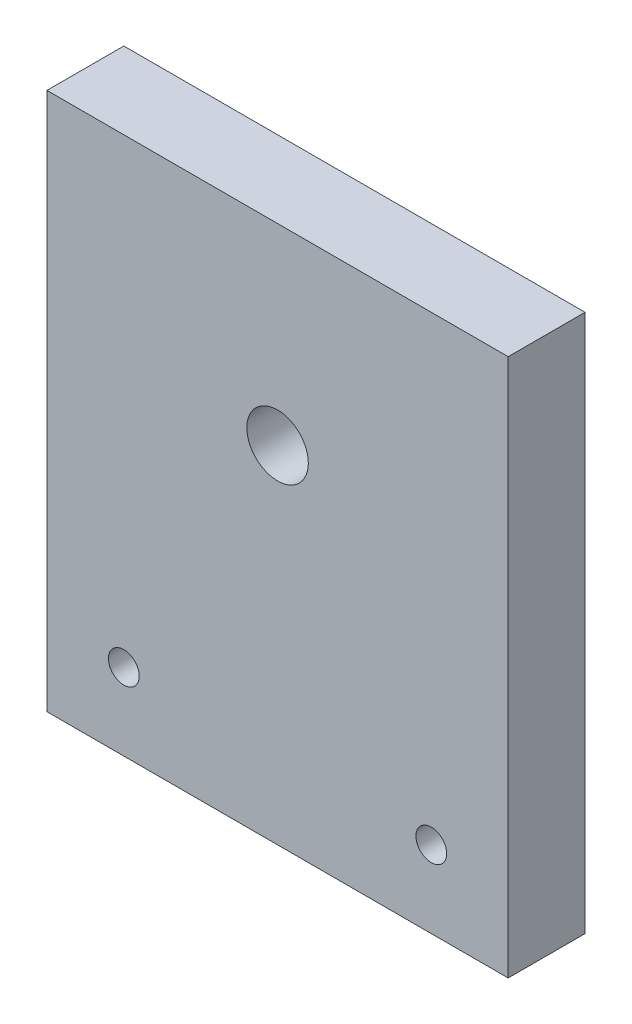
ISO-10303-21;
HEADER;
FILE_DESCRIPTION(('STEP AP214'),'2;1');
FILE_NAME('part.step','',(''),(''),'','','');
FILE_SCHEMA(('AUTOMOTIVE_DESIGN { 1 0 10303 214 1 1 1 1 }'));
ENDSEC;
DATA;
#1=APPLICATION_CONTEXT('core data for automotive mechanical design processes');
#2=APPLICATION_PROTOCOL_DEFINITION('international standard','automotive_design',2000,#1);
#3=PRODUCT_CONTEXT('',#1,'mechanical');
#4=PRODUCT('Part','Part','',(#3));
#5=PRODUCT_RELATED_PRODUCT_CATEGORY('part','',(#4));
#6=PRODUCT_DEFINITION_FORMATION('','',#4);
#7=PRODUCT_DEFINITION_CONTEXT('part definition',#1,'design');
#8=PRODUCT_DEFINITION('design','',#6,#7);
#9=PRODUCT_DEFINITION_SHAPE('','',#8);
#10=(LENGTH_UNIT() NAMED_UNIT(*) SI_UNIT(.MILLI.,.METRE.));
#11=(NAMED_UNIT(*) PLANE_ANGLE_UNIT() SI_UNIT($,.RADIAN.));
#12=(NAMED_UNIT(*) SI_UNIT($,.STERADIAN.) SOLID_ANGLE_UNIT());
#13=UNCERTAINTY_MEASURE_WITH_UNIT(LENGTH_MEASURE(1.E-05),#10,'distance_accuracy_value','');
#14=(GEOMETRIC_REPRESENTATION_CONTEXT(3) GLOBAL_UNCERTAINTY_ASSIGNED_CONTEXT((#13)) GLOBAL_UNIT_ASSIGNED_CONTEXT((#10,
#11,#12)) REPRESENTATION_CONTEXT('',''));
#15=CARTESIAN_POINT('',(0.,0.,0.));
#16=DIRECTION('',(0.,0.,1.));
#17=DIRECTION('',(1.,0.,0.));
#18=AXIS2_PLACEMENT_3D('',#15,#16,#17);
#19=CARTESIAN_POINT('',(30.,0.,10.));
#20=DIRECTION('',(1.,0.,0.));
#21=DIRECTION('',(0.,1.,0.));
#22=AXIS2_PLACEMENT_3D('',#19,#20,#21);
#23=PLANE('',#22);
#24=DIRECTION('',(0.,-1.,0.));
#25=VECTOR('',#24,1.);
#26=CARTESIAN_POINT('',(30.,0.,0.));
#27=LINE('',#26,#25);
#28=CARTESIAN_POINT('',(30.,25.,0.));
#29=VERTEX_POINT('',#28);
#30=CARTESIAN_POINT('',(30.,-45.,0.));
#31=VERTEX_POINT('',#30);
#32=EDGE_CURVE('E111',#29,#31,#27,.T.);
#33=ORIENTED_EDGE('',*,*,#32,.F.);
#34=DIRECTION('',(0.,0.,-1.));
#35=VECTOR('',#34,1.);
#36=CARTESIAN_POINT('',(30.,25.,10.));
#37=LINE('',#36,#35);
#38=CARTESIAN_POINT('',(30.,25.,10.));
#39=VERTEX_POINT('',#38);
#40=EDGE_CURVE('E11',#39,#29,#37,.T.);
#41=ORIENTED_EDGE('',*,*,#40,.F.);
#42=DIRECTION('',(0.,-1.,0.));
#43=VECTOR('',#42,1.);
#44=CARTESIAN_POINT('',(30.,0.,10.));
#45=LINE('',#44,#43);
#46=CARTESIAN_POINT('',(30.,-45.,10.));
#47=VERTEX_POINT('',#46);
#48=EDGE_CURVE('E95',#39,#47,#45,.T.);
#49=ORIENTED_EDGE('',*,*,#48,.T.);
#50=DIRECTION('',(0.,0.,-1.));
#51=VECTOR('',#50,1.);
#52=CARTESIAN_POINT('',(30.,-45.,10.));
#53=LINE('',#52,#51);
#54=EDGE_CURVE('E74',#47,#31,#53,.T.);
#55=ORIENTED_EDGE('',*,*,#54,.T.);
#56=EDGE_LOOP('',(#33,#41,#49,#55));
#57=FACE_BOUND('',#56,.T.);
#58=ADVANCED_FACE('F34',(#57),#23,.T.);
#59=CARTESIAN_POINT('',(0.,25.,10.));
#60=DIRECTION('',(0.,1.,0.));
#61=DIRECTION('',(0.,0.,1.));
#62=AXIS2_PLACEMENT_3D('',#59,#60,#61);
#63=PLANE('',#62);
#64=DIRECTION('',(1.,0.,0.));
#65=VECTOR('',#64,1.);
#66=CARTESIAN_POINT('',(0.,25.,0.));
#67=LINE('',#66,#65);
#68=CARTESIAN_POINT('',(-30.,25.,0.));
#69=VERTEX_POINT('',#68);
#70=EDGE_CURVE('E86',#69,#29,#67,.T.);
#71=ORIENTED_EDGE('',*,*,#70,.F.);
#72=DIRECTION('',(0.,0.,-1.));
#73=VECTOR('',#72,1.);
#74=CARTESIAN_POINT('',(-30.,25.,10.));
#75=LINE('',#74,#73);
#76=CARTESIAN_POINT('',(-30.,25.,10.));
#77=VERTEX_POINT('',#76);
#78=EDGE_CURVE('E43',#77,#69,#75,.T.);
#79=ORIENTED_EDGE('',*,*,#78,.F.);
#80=DIRECTION('',(1.,0.,0.));
#81=VECTOR('',#80,1.);
#82=CARTESIAN_POINT('',(0.,25.,10.));
#83=LINE('',#82,#81);
#84=EDGE_CURVE('E84',#77,#39,#83,.T.);
#85=ORIENTED_EDGE('',*,*,#84,.T.);
#86=ORIENTED_EDGE('',*,*,#40,.T.);
#87=EDGE_LOOP('',(#71,#79,#85,#86));
#88=FACE_BOUND('',#87,.T.);
#89=ADVANCED_FACE('F82',(#88),#63,.T.);
#90=CARTESIAN_POINT('',(-30.,0.,10.));
#91=DIRECTION('',(1.,0.,0.));
#92=DIRECTION('',(0.,1.,0.));
#93=AXIS2_PLACEMENT_3D('',#90,#91,#92);
#94=PLANE('',#93);
#95=DIRECTION('',(0.,-1.,0.));
#96=VECTOR('',#95,1.);
#97=CARTESIAN_POINT('',(-30.,0.,0.));
#98=LINE('',#97,#96);
#99=CARTESIAN_POINT('',(-30.,-45.,0.));
#100=VERTEX_POINT('',#99);
#101=EDGE_CURVE('E114',#69,#100,#98,.T.);
#102=ORIENTED_EDGE('',*,*,#101,.T.);
#103=DIRECTION('',(0.,0.,-1.));
#104=VECTOR('',#103,1.);
#105=CARTESIAN_POINT('',(-30.,-45.,10.));
#106=LINE('',#105,#104);
#107=CARTESIAN_POINT('',(-30.,-45.,10.));
#108=VERTEX_POINT('',#107);
#109=EDGE_CURVE('E89',#108,#100,#106,.T.);
#110=ORIENTED_EDGE('',*,*,#109,.F.);
#111=DIRECTION('',(0.,-1.,0.));
#112=VECTOR('',#111,1.);
#113=CARTESIAN_POINT('',(-30.,0.,10.));
#114=LINE('',#113,#112);
#115=EDGE_CURVE('E91',#77,#108,#114,.T.);
#116=ORIENTED_EDGE('',*,*,#115,.F.);
#117=ORIENTED_EDGE('',*,*,#78,.T.);
#118=EDGE_LOOP('',(#102,#110,#116,#117));
#119=FACE_BOUND('',#118,.T.);
#120=ADVANCED_FACE('F92',(#119),#94,.F.);
#121=CARTESIAN_POINT('',(-20.,-35.,10.));
#122=DIRECTION('',(0.,0.,-1.));
#123=DIRECTION('',(-1.,0.,0.));
#124=AXIS2_PLACEMENT_3D('',#121,#122,#123);
#125=CYLINDRICAL_SURFACE('',#124,2.);
#126=CARTESIAN_POINT('',(-20.,-35.,10.));
#127=DIRECTION('',(0.,0.,1.));
#128=DIRECTION('',(1.,0.,0.));
#129=AXIS2_PLACEMENT_3D('',#126,#127,#128);
#130=CIRCLE('',#129,2.);
#131=CARTESIAN_POINT('',(-18.,-35.,10.));
#132=VERTEX_POINT('',#131);
#133=EDGE_CURVE('E97',#132,#132,#130,.T.);
#134=ORIENTED_EDGE('',*,*,#133,.T.);
#135=EDGE_LOOP('',(#134));
#136=FACE_BOUND('',#135,.T.);
#137=CARTESIAN_POINT('',(-20.,-35.,0.));
#138=DIRECTION('',(0.,0.,1.));
#139=DIRECTION('',(1.,0.,0.));
#140=AXIS2_PLACEMENT_3D('',#137,#138,#139);
#141=CIRCLE('',#140,2.);
#142=CARTESIAN_POINT('',(-18.,-35.,0.));
#143=VERTEX_POINT('',#142);
#144=EDGE_CURVE('E108',#143,#143,#141,.T.);
#145=ORIENTED_EDGE('',*,*,#144,.F.);
#146=EDGE_LOOP('',(#145));
#147=FACE_BOUND('',#146,.T.);
#148=ADVANCED_FACE('F130',(#136,#147),#125,.F.);
#149=CARTESIAN_POINT('',(20.,-35.,10.));
#150=DIRECTION('',(0.,0.,-1.));
#151=DIRECTION('',(-1.,0.,0.));
#152=AXIS2_PLACEMENT_3D('',#149,#150,#151);
#153=CYLINDRICAL_SURFACE('',#152,2.);
#154=CARTESIAN_POINT('',(20.,-35.,10.));
#155=DIRECTION('',(0.,0.,1.));
#156=DIRECTION('',(1.,0.,0.));
#157=AXIS2_PLACEMENT_3D('',#154,#155,#156);
#158=CIRCLE('',#157,2.);
#159=CARTESIAN_POINT('',(22.,-35.,10.));
#160=VERTEX_POINT('',#159);
#161=EDGE_CURVE('E143',#160,#160,#158,.T.);
#162=ORIENTED_EDGE('',*,*,#161,.T.);
#163=EDGE_LOOP('',(#162));
#164=FACE_BOUND('',#163,.T.);
#165=CARTESIAN_POINT('',(20.,-35.,0.));
#166=DIRECTION('',(0.,0.,1.));
#167=DIRECTION('',(1.,0.,0.));
#168=AXIS2_PLACEMENT_3D('',#165,#166,#167);
#169=CIRCLE('',#168,2.);
#170=CARTESIAN_POINT('',(22.,-35.,0.));
#171=VERTEX_POINT('',#170);
#172=EDGE_CURVE('E105',#171,#171,#169,.T.);
#173=ORIENTED_EDGE('',*,*,#172,.F.);
#174=EDGE_LOOP('',(#173));
#175=FACE_BOUND('',#174,.T.);
#176=ADVANCED_FACE('F132',(#164,#175),#153,.F.);
#177=CARTESIAN_POINT('',(0.,0.,10.));
#178=DIRECTION('',(0.,0.,-1.));
#179=DIRECTION('',(-1.,0.,0.));
#180=AXIS2_PLACEMENT_3D('',#177,#178,#179);
#181=CYLINDRICAL_SURFACE('',#180,4.);
#182=CARTESIAN_POINT('',(0.,0.,10.));
#183=DIRECTION('',(0.,0.,1.));
#184=DIRECTION('',(1.,0.,0.));
#185=AXIS2_PLACEMENT_3D('',#182,#183,#184);
#186=CIRCLE('',#185,4.);
#187=CARTESIAN_POINT('',(4.,0.,10.));
#188=VERTEX_POINT('',#187);
#189=EDGE_CURVE('E117',#188,#188,#186,.T.);
#190=ORIENTED_EDGE('',*,*,#189,.T.);
#191=EDGE_LOOP('',(#190));
#192=FACE_BOUND('',#191,.T.);
#193=CARTESIAN_POINT('',(0.,0.,0.));
#194=DIRECTION('',(0.,0.,1.));
#195=DIRECTION('',(1.,0.,0.));
#196=AXIS2_PLACEMENT_3D('',#193,#194,#195);
#197=CIRCLE('',#196,4.);
#198=CARTESIAN_POINT('',(4.,0.,0.));
#199=VERTEX_POINT('',#198);
#200=EDGE_CURVE('E102',#199,#199,#197,.T.);
#201=ORIENTED_EDGE('',*,*,#200,.F.);
#202=EDGE_LOOP('',(#201));
#203=FACE_BOUND('',#202,.T.);
#204=ADVANCED_FACE('F36',(#192,#203),#181,.F.);
#205=CARTESIAN_POINT('',(0.,-45.,10.));
#206=DIRECTION('',(0.,1.,0.));
#207=DIRECTION('',(0.,0.,1.));
#208=AXIS2_PLACEMENT_3D('',#205,#206,#207);
#209=PLANE('',#208);
#210=DIRECTION('',(1.,0.,0.));
#211=VECTOR('',#210,1.);
#212=CARTESIAN_POINT('',(0.,-45.,0.));
#213=LINE('',#212,#211);
#214=EDGE_CURVE('E67',#100,#31,#213,.T.);
#215=ORIENTED_EDGE('',*,*,#214,.T.);
#216=ORIENTED_EDGE('',*,*,#54,.F.);
#217=DIRECTION('',(1.,0.,0.));
#218=VECTOR('',#217,1.);
#219=CARTESIAN_POINT('',(0.,-45.,10.));
#220=LINE('',#219,#218);
#221=EDGE_CURVE('E51',#108,#47,#220,.T.);
#222=ORIENTED_EDGE('',*,*,#221,.F.);
#223=ORIENTED_EDGE('',*,*,#109,.T.);
#224=EDGE_LOOP('',(#215,#216,#222,#223));
#225=FACE_BOUND('',#224,.T.);
#226=ADVANCED_FACE('F120',(#225),#209,.F.);
#227=CARTESIAN_POINT('',(0.,0.,10.));
#228=DIRECTION('',(0.,0.,1.));
#229=DIRECTION('',(1.,0.,0.));
#230=AXIS2_PLACEMENT_3D('',#227,#228,#229);
#231=PLANE('',#230);
#232=ORIENTED_EDGE('',*,*,#189,.F.);
#233=EDGE_LOOP('',(#232));
#234=FACE_BOUND('',#233,.T.);
#235=ORIENTED_EDGE('',*,*,#161,.F.);
#236=EDGE_LOOP('',(#235));
#237=FACE_BOUND('',#236,.T.);
#238=ORIENTED_EDGE('',*,*,#133,.F.);
#239=EDGE_LOOP('',(#238));
#240=FACE_BOUND('',#239,.T.);
#241=ORIENTED_EDGE('',*,*,#48,.F.);
#242=ORIENTED_EDGE('',*,*,#84,.F.);
#243=ORIENTED_EDGE('',*,*,#115,.T.);
#244=ORIENTED_EDGE('',*,*,#221,.T.);
#245=EDGE_LOOP('',(#241,#242,#243,#244));
#246=FACE_BOUND('',#245,.T.);
#247=ADVANCED_FACE('F94',(#234,#237,#240,#246),#231,.T.);
#248=CARTESIAN_POINT('',(0.,0.,0.));
#249=DIRECTION('',(0.,0.,1.));
#250=DIRECTION('',(1.,0.,0.));
#251=AXIS2_PLACEMENT_3D('',#248,#249,#250);
#252=PLANE('',#251);
#253=ORIENTED_EDGE('',*,*,#200,.T.);
#254=EDGE_LOOP('',(#253));
#255=FACE_BOUND('',#254,.T.);
#256=ORIENTED_EDGE('',*,*,#172,.T.);
#257=EDGE_LOOP('',(#256));
#258=FACE_BOUND('',#257,.T.);
#259=ORIENTED_EDGE('',*,*,#144,.T.);
#260=EDGE_LOOP('',(#259));
#261=FACE_BOUND('',#260,.T.);
#262=ORIENTED_EDGE('',*,*,#32,.T.);
#263=ORIENTED_EDGE('',*,*,#214,.F.);
#264=ORIENTED_EDGE('',*,*,#101,.F.);
#265=ORIENTED_EDGE('',*,*,#70,.T.);
#266=EDGE_LOOP('',(#262,#263,#264,#265));
#267=FACE_BOUND('',#266,.T.);
#268=ADVANCED_FACE('F121',(#255,#258,#261,#267),#252,.F.);
#269=CLOSED_SHELL('',(#58,#89,#120,#148,#176,#204,#226,#247,#268));
#270=MANIFOLD_SOLID_BREP('B2',#269);
#271=ADVANCED_BREP_SHAPE_REPRESENTATION('',(#18,#270),#14);
#272=SHAPE_DEFINITION_REPRESENTATION(#9,#271);
ENDSEC;
END-ISO-10303-21;
